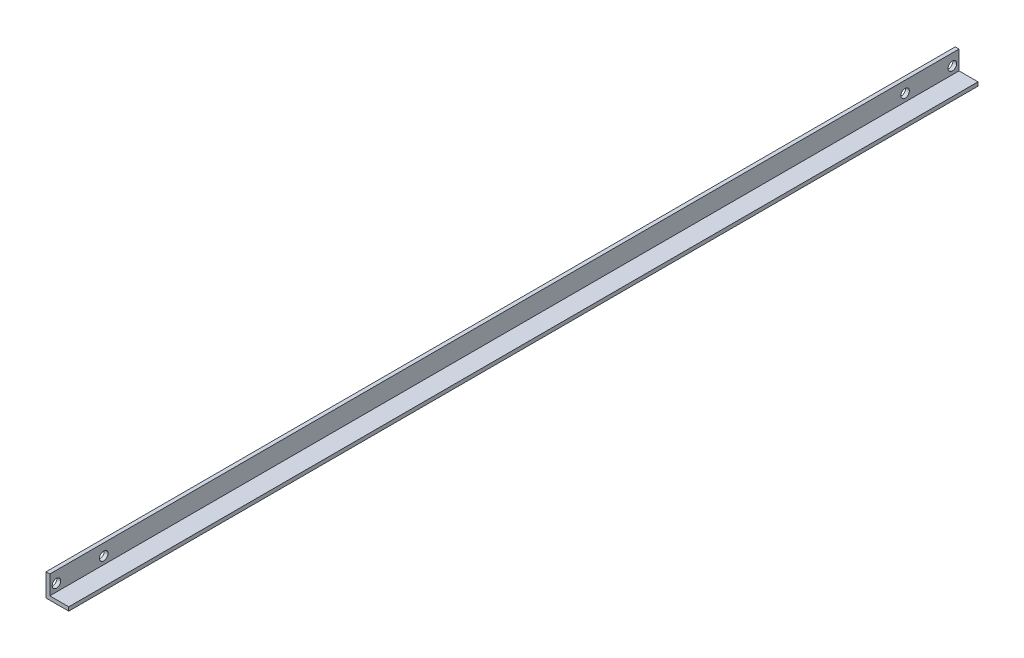
ISO-10303-21;
HEADER;
FILE_DESCRIPTION(('STEP AP214'),'2;1');
FILE_NAME('part.step','',(''),(''),'','','');
FILE_SCHEMA(('AUTOMOTIVE_DESIGN { 1 0 10303 214 1 1 1 1 }'));
ENDSEC;
DATA;
#1=APPLICATION_CONTEXT('core data for automotive mechanical design processes');
#2=APPLICATION_PROTOCOL_DEFINITION('international standard','automotive_design',2000,#1);
#3=PRODUCT_CONTEXT('',#1,'mechanical');
#4=PRODUCT('Part','Part','',(#3));
#5=PRODUCT_RELATED_PRODUCT_CATEGORY('part','',(#4));
#6=PRODUCT_DEFINITION_FORMATION('','',#4);
#7=PRODUCT_DEFINITION_CONTEXT('part definition',#1,'design');
#8=PRODUCT_DEFINITION('design','',#6,#7);
#9=PRODUCT_DEFINITION_SHAPE('','',#8);
#10=(LENGTH_UNIT() NAMED_UNIT(*) SI_UNIT(.MILLI.,.METRE.));
#11=(NAMED_UNIT(*) PLANE_ANGLE_UNIT() SI_UNIT($,.RADIAN.));
#12=(NAMED_UNIT(*) SI_UNIT($,.STERADIAN.) SOLID_ANGLE_UNIT());
#13=UNCERTAINTY_MEASURE_WITH_UNIT(LENGTH_MEASURE(1.E-05),#10,'distance_accuracy_value','');
#14=(GEOMETRIC_REPRESENTATION_CONTEXT(3) GLOBAL_UNCERTAINTY_ASSIGNED_CONTEXT((#13)) GLOBAL_UNIT_ASSIGNED_CONTEXT((#10,
#11,#12)) REPRESENTATION_CONTEXT('',''));
#15=CARTESIAN_POINT('',(0.,0.,0.));
#16=DIRECTION('',(0.,0.,1.));
#17=DIRECTION('',(1.,0.,0.));
#18=AXIS2_PLACEMENT_3D('',#15,#16,#17);
#19=CARTESIAN_POINT('',(0.,19.05,762.));
#20=DIRECTION('',(1.,0.,0.));
#21=DIRECTION('',(0.,1.,0.));
#22=AXIS2_PLACEMENT_3D('',#19,#20,#21);
#23=PLANE('',#22);
#24=CARTESIAN_POINT('',(0.,9.525,5.58800000000004));
#25=DIRECTION('',(-1.,0.,0.));
#26=DIRECTION('',(0.,0.,1.));
#27=AXIS2_PLACEMENT_3D('',#24,#25,#26);
#28=CIRCLE('',#27,3.571875);
#29=CARTESIAN_POINT('',(0.,9.525,9.15987500000004));
#30=VERTEX_POINT('',#29);
#31=EDGE_CURVE('E185',#30,#30,#28,.T.);
#32=ORIENTED_EDGE('',*,*,#31,.F.);
#33=EDGE_LOOP('',(#32));
#34=FACE_BOUND('',#33,.T.);
#35=CARTESIAN_POINT('',(0.,9.525,45.212));
#36=DIRECTION('',(-1.,0.,0.));
#37=DIRECTION('',(0.,0.,1.));
#38=AXIS2_PLACEMENT_3D('',#35,#36,#37);
#39=CIRCLE('',#38,3.571875);
#40=CARTESIAN_POINT('',(0.,9.525,48.783875));
#41=VERTEX_POINT('',#40);
#42=EDGE_CURVE('E149',#41,#41,#39,.T.);
#43=ORIENTED_EDGE('',*,*,#42,.F.);
#44=EDGE_LOOP('',(#43));
#45=FACE_BOUND('',#44,.T.);
#46=CARTESIAN_POINT('',(0.,9.525,716.787));
#47=DIRECTION('',(-1.,0.,0.));
#48=DIRECTION('',(0.,0.,1.));
#49=AXIS2_PLACEMENT_3D('',#46,#47,#48);
#50=CIRCLE('',#49,3.571875);
#51=CARTESIAN_POINT('',(0.,9.525,720.358875));
#52=VERTEX_POINT('',#51);
#53=EDGE_CURVE('E138',#52,#52,#50,.T.);
#54=ORIENTED_EDGE('',*,*,#53,.F.);
#55=EDGE_LOOP('',(#54));
#56=FACE_BOUND('',#55,.T.);
#57=CARTESIAN_POINT('',(0.,9.525,756.412));
#58=DIRECTION('',(-1.,0.,0.));
#59=DIRECTION('',(0.,0.,1.));
#60=AXIS2_PLACEMENT_3D('',#57,#58,#59);
#61=CIRCLE('',#60,3.571875);
#62=CARTESIAN_POINT('',(0.,9.525,759.983875));
#63=VERTEX_POINT('',#62);
#64=EDGE_CURVE('E137',#63,#63,#61,.T.);
#65=ORIENTED_EDGE('',*,*,#64,.F.);
#66=EDGE_LOOP('',(#65));
#67=FACE_BOUND('',#66,.T.);
#68=DIRECTION('',(0.,-1.,0.));
#69=VECTOR('',#68,1.);
#70=CARTESIAN_POINT('',(0.,19.05,0.));
#71=LINE('',#70,#69);
#72=CARTESIAN_POINT('',(0.,19.05,0.));
#73=VERTEX_POINT('',#72);
#74=CARTESIAN_POINT('',(0.,0.,0.));
#75=VERTEX_POINT('',#74);
#76=EDGE_CURVE('E119',#73,#75,#71,.T.);
#77=ORIENTED_EDGE('',*,*,#76,.T.);
#78=DIRECTION('',(0.,0.,-1.));
#79=VECTOR('',#78,1.);
#80=CARTESIAN_POINT('',(0.,0.,762.));
#81=LINE('',#80,#79);
#82=CARTESIAN_POINT('',(0.,0.,762.));
#83=VERTEX_POINT('',#82);
#84=EDGE_CURVE('E11',#83,#75,#81,.T.);
#85=ORIENTED_EDGE('',*,*,#84,.F.);
#86=DIRECTION('',(0.,-1.,0.));
#87=VECTOR('',#86,1.);
#88=CARTESIAN_POINT('',(0.,19.05,762.));
#89=LINE('',#88,#87);
#90=CARTESIAN_POINT('',(0.,19.05,762.));
#91=VERTEX_POINT('',#90);
#92=EDGE_CURVE('E130',#91,#83,#89,.T.);
#93=ORIENTED_EDGE('',*,*,#92,.F.);
#94=DIRECTION('',(0.,0.,-1.));
#95=VECTOR('',#94,1.);
#96=CARTESIAN_POINT('',(0.,19.05,762.));
#97=LINE('',#96,#95);
#98=EDGE_CURVE('E115',#91,#73,#97,.T.);
#99=ORIENTED_EDGE('',*,*,#98,.T.);
#100=EDGE_LOOP('',(#77,#85,#93,#99));
#101=FACE_BOUND('',#100,.T.);
#102=ADVANCED_FACE('F33',(#34,#45,#56,#67,#101),#23,.F.);
#103=CARTESIAN_POINT('',(0.,0.,762.));
#104=DIRECTION('',(0.,1.,0.));
#105=DIRECTION('',(0.,0.,1.));
#106=AXIS2_PLACEMENT_3D('',#103,#104,#105);
#107=PLANE('',#106);
#108=DIRECTION('',(1.,0.,0.));
#109=VECTOR('',#108,1.);
#110=CARTESIAN_POINT('',(0.,0.,0.));
#111=LINE('',#110,#109);
#112=CARTESIAN_POINT('',(19.05,0.,0.));
#113=VERTEX_POINT('',#112);
#114=EDGE_CURVE('E122',#75,#113,#111,.T.);
#115=ORIENTED_EDGE('',*,*,#114,.T.);
#116=DIRECTION('',(0.,0.,-1.));
#117=VECTOR('',#116,1.);
#118=CARTESIAN_POINT('',(19.05,0.,762.));
#119=LINE('',#118,#117);
#120=CARTESIAN_POINT('',(19.05,0.,762.));
#121=VERTEX_POINT('',#120);
#122=EDGE_CURVE('E42',#121,#113,#119,.T.);
#123=ORIENTED_EDGE('',*,*,#122,.F.);
#124=DIRECTION('',(1.,0.,0.));
#125=VECTOR('',#124,1.);
#126=CARTESIAN_POINT('',(0.,0.,762.));
#127=LINE('',#126,#125);
#128=EDGE_CURVE('E88',#83,#121,#127,.T.);
#129=ORIENTED_EDGE('',*,*,#128,.F.);
#130=ORIENTED_EDGE('',*,*,#84,.T.);
#131=EDGE_LOOP('',(#115,#123,#129,#130));
#132=FACE_BOUND('',#131,.T.);
#133=ADVANCED_FACE('F158',(#132),#107,.F.);
#134=CARTESIAN_POINT('',(19.05,0.,762.));
#135=DIRECTION('',(-1.,0.,0.));
#136=DIRECTION('',(0.,0.,1.));
#137=AXIS2_PLACEMENT_3D('',#134,#135,#136);
#138=PLANE('',#137);
#139=DIRECTION('',(0.,1.,0.));
#140=VECTOR('',#139,1.);
#141=CARTESIAN_POINT('',(19.05,0.,0.));
#142=LINE('',#141,#140);
#143=CARTESIAN_POINT('',(19.05,3.175,0.));
#144=VERTEX_POINT('',#143);
#145=EDGE_CURVE('E125',#113,#144,#142,.T.);
#146=ORIENTED_EDGE('',*,*,#145,.T.);
#147=DIRECTION('',(0.,0.,-1.));
#148=VECTOR('',#147,1.);
#149=CARTESIAN_POINT('',(19.05,3.175,762.));
#150=LINE('',#149,#148);
#151=CARTESIAN_POINT('',(19.05,3.175,762.));
#152=VERTEX_POINT('',#151);
#153=EDGE_CURVE('E110',#152,#144,#150,.T.);
#154=ORIENTED_EDGE('',*,*,#153,.F.);
#155=DIRECTION('',(0.,1.,0.));
#156=VECTOR('',#155,1.);
#157=CARTESIAN_POINT('',(19.05,0.,762.));
#158=LINE('',#157,#156);
#159=EDGE_CURVE('E101',#121,#152,#158,.T.);
#160=ORIENTED_EDGE('',*,*,#159,.F.);
#161=ORIENTED_EDGE('',*,*,#122,.T.);
#162=EDGE_LOOP('',(#146,#154,#160,#161));
#163=FACE_BOUND('',#162,.T.);
#164=ADVANCED_FACE('F161',(#163),#138,.F.);
#165=CARTESIAN_POINT('',(19.05,3.175,762.));
#166=DIRECTION('',(0.,-1.,0.));
#167=DIRECTION('',(1.,0.,0.));
#168=AXIS2_PLACEMENT_3D('',#165,#166,#167);
#169=PLANE('',#168);
#170=DIRECTION('',(-1.,0.,0.));
#171=VECTOR('',#170,1.);
#172=CARTESIAN_POINT('',(19.05,3.175,0.));
#173=LINE('',#172,#171);
#174=CARTESIAN_POINT('',(3.175,3.175,0.));
#175=VERTEX_POINT('',#174);
#176=EDGE_CURVE('E109',#144,#175,#173,.T.);
#177=ORIENTED_EDGE('',*,*,#176,.T.);
#178=DIRECTION('',(0.,0.,-1.));
#179=VECTOR('',#178,1.);
#180=CARTESIAN_POINT('',(3.175,3.175,762.));
#181=LINE('',#180,#179);
#182=CARTESIAN_POINT('',(3.175,3.175,762.));
#183=VERTEX_POINT('',#182);
#184=EDGE_CURVE('E106',#183,#175,#181,.T.);
#185=ORIENTED_EDGE('',*,*,#184,.F.);
#186=DIRECTION('',(-1.,0.,0.));
#187=VECTOR('',#186,1.);
#188=CARTESIAN_POINT('',(19.05,3.175,762.));
#189=LINE('',#188,#187);
#190=EDGE_CURVE('E95',#152,#183,#189,.T.);
#191=ORIENTED_EDGE('',*,*,#190,.F.);
#192=ORIENTED_EDGE('',*,*,#153,.T.);
#193=EDGE_LOOP('',(#177,#185,#191,#192));
#194=FACE_BOUND('',#193,.T.);
#195=ADVANCED_FACE('F107',(#194),#169,.F.);
#196=CARTESIAN_POINT('',(3.175,3.175,762.));
#197=DIRECTION('',(-1.,0.,0.));
#198=DIRECTION('',(0.,-1.,0.));
#199=AXIS2_PLACEMENT_3D('',#196,#197,#198);
#200=PLANE('',#199);
#201=CARTESIAN_POINT('',(3.175,9.525,5.58800000000004));
#202=DIRECTION('',(-1.,0.,0.));
#203=DIRECTION('',(0.,-1.,0.));
#204=AXIS2_PLACEMENT_3D('',#201,#202,#203);
#205=CIRCLE('',#204,3.571875);
#206=CARTESIAN_POINT('',(3.175,5.953125,5.58800000000004));
#207=VERTEX_POINT('',#206);
#208=EDGE_CURVE('E36',#207,#207,#205,.T.);
#209=ORIENTED_EDGE('',*,*,#208,.T.);
#210=EDGE_LOOP('',(#209));
#211=FACE_BOUND('',#210,.T.);
#212=CARTESIAN_POINT('',(3.175,9.525,45.212));
#213=DIRECTION('',(-1.,0.,0.));
#214=DIRECTION('',(0.,-1.,0.));
#215=AXIS2_PLACEMENT_3D('',#212,#213,#214);
#216=CIRCLE('',#215,3.571875);
#217=CARTESIAN_POINT('',(3.175,5.953125,45.212));
#218=VERTEX_POINT('',#217);
#219=EDGE_CURVE('E144',#218,#218,#216,.T.);
#220=ORIENTED_EDGE('',*,*,#219,.T.);
#221=EDGE_LOOP('',(#220));
#222=FACE_BOUND('',#221,.T.);
#223=CARTESIAN_POINT('',(3.175,9.525,716.787));
#224=DIRECTION('',(-1.,0.,0.));
#225=DIRECTION('',(0.,-1.,0.));
#226=AXIS2_PLACEMENT_3D('',#223,#224,#225);
#227=CIRCLE('',#226,3.571875);
#228=CARTESIAN_POINT('',(3.175,5.953125,716.787));
#229=VERTEX_POINT('',#228);
#230=EDGE_CURVE('E135',#229,#229,#227,.T.);
#231=ORIENTED_EDGE('',*,*,#230,.T.);
#232=EDGE_LOOP('',(#231));
#233=FACE_BOUND('',#232,.T.);
#234=CARTESIAN_POINT('',(3.175,9.525,756.412));
#235=DIRECTION('',(-1.,0.,0.));
#236=DIRECTION('',(0.,-1.,0.));
#237=AXIS2_PLACEMENT_3D('',#234,#235,#236);
#238=CIRCLE('',#237,3.571875);
#239=CARTESIAN_POINT('',(3.175,5.953125,756.412));
#240=VERTEX_POINT('',#239);
#241=EDGE_CURVE('E123',#240,#240,#238,.T.);
#242=ORIENTED_EDGE('',*,*,#241,.T.);
#243=EDGE_LOOP('',(#242));
#244=FACE_BOUND('',#243,.T.);
#245=DIRECTION('',(0.,1.,0.));
#246=VECTOR('',#245,1.);
#247=CARTESIAN_POINT('',(3.175,3.175,0.));
#248=LINE('',#247,#246);
#249=CARTESIAN_POINT('',(3.175,19.05,0.));
#250=VERTEX_POINT('',#249);
#251=EDGE_CURVE('E74',#175,#250,#248,.T.);
#252=ORIENTED_EDGE('',*,*,#251,.T.);
#253=DIRECTION('',(0.,0.,-1.));
#254=VECTOR('',#253,1.);
#255=CARTESIAN_POINT('',(3.175,19.05,762.));
#256=LINE('',#255,#254);
#257=CARTESIAN_POINT('',(3.175,19.05,762.));
#258=VERTEX_POINT('',#257);
#259=EDGE_CURVE('E111',#258,#250,#256,.T.);
#260=ORIENTED_EDGE('',*,*,#259,.F.);
#261=DIRECTION('',(0.,1.,0.));
#262=VECTOR('',#261,1.);
#263=CARTESIAN_POINT('',(3.175,3.175,762.));
#264=LINE('',#263,#262);
#265=EDGE_CURVE('E99',#183,#258,#264,.T.);
#266=ORIENTED_EDGE('',*,*,#265,.F.);
#267=ORIENTED_EDGE('',*,*,#184,.T.);
#268=EDGE_LOOP('',(#252,#260,#266,#267));
#269=FACE_BOUND('',#268,.T.);
#270=ADVANCED_FACE('F113',(#211,#222,#233,#244,#269),#200,.F.);
#271=CARTESIAN_POINT('',(3.175,19.05,762.));
#272=DIRECTION('',(0.,-1.,0.));
#273=DIRECTION('',(0.,0.,-1.));
#274=AXIS2_PLACEMENT_3D('',#271,#272,#273);
#275=PLANE('',#274);
#276=DIRECTION('',(-1.,0.,0.));
#277=VECTOR('',#276,1.);
#278=CARTESIAN_POINT('',(3.175,19.05,0.));
#279=LINE('',#278,#277);
#280=EDGE_CURVE('E80',#250,#73,#279,.T.);
#281=ORIENTED_EDGE('',*,*,#280,.T.);
#282=ORIENTED_EDGE('',*,*,#98,.F.);
#283=DIRECTION('',(-1.,0.,0.));
#284=VECTOR('',#283,1.);
#285=CARTESIAN_POINT('',(3.175,19.05,762.));
#286=LINE('',#285,#284);
#287=EDGE_CURVE('E51',#258,#91,#286,.T.);
#288=ORIENTED_EDGE('',*,*,#287,.F.);
#289=ORIENTED_EDGE('',*,*,#259,.T.);
#290=EDGE_LOOP('',(#281,#282,#288,#289));
#291=FACE_BOUND('',#290,.T.);
#292=ADVANCED_FACE('F166',(#291),#275,.F.);
#293=CARTESIAN_POINT('',(0.,0.,762.));
#294=DIRECTION('',(0.,0.,1.));
#295=DIRECTION('',(1.,0.,0.));
#296=AXIS2_PLACEMENT_3D('',#293,#294,#295);
#297=PLANE('',#296);
#298=ORIENTED_EDGE('',*,*,#92,.T.);
#299=ORIENTED_EDGE('',*,*,#128,.T.);
#300=ORIENTED_EDGE('',*,*,#159,.T.);
#301=ORIENTED_EDGE('',*,*,#190,.T.);
#302=ORIENTED_EDGE('',*,*,#265,.T.);
#303=ORIENTED_EDGE('',*,*,#287,.T.);
#304=EDGE_LOOP('',(#298,#299,#300,#301,#302,#303));
#305=FACE_BOUND('',#304,.T.);
#306=ADVANCED_FACE('F97',(#305),#297,.T.);
#307=CARTESIAN_POINT('',(0.,0.,0.));
#308=DIRECTION('',(0.,0.,1.));
#309=DIRECTION('',(1.,0.,0.));
#310=AXIS2_PLACEMENT_3D('',#307,#308,#309);
#311=PLANE('',#310);
#312=ORIENTED_EDGE('',*,*,#76,.F.);
#313=ORIENTED_EDGE('',*,*,#280,.F.);
#314=ORIENTED_EDGE('',*,*,#251,.F.);
#315=ORIENTED_EDGE('',*,*,#176,.F.);
#316=ORIENTED_EDGE('',*,*,#145,.F.);
#317=ORIENTED_EDGE('',*,*,#114,.F.);
#318=EDGE_LOOP('',(#312,#313,#314,#315,#316,#317));
#319=FACE_BOUND('',#318,.T.);
#320=ADVANCED_FACE('F164',(#319),#311,.F.);
#321=CARTESIAN_POINT('',(0.,9.525,756.412));
#322=DIRECTION('',(-1.,0.,0.));
#323=DIRECTION('',(0.,0.,1.));
#324=AXIS2_PLACEMENT_3D('',#321,#322,#323);
#325=CYLINDRICAL_SURFACE('',#324,3.571875);
#326=ORIENTED_EDGE('',*,*,#64,.T.);
#327=EDGE_LOOP('',(#326));
#328=FACE_BOUND('',#327,.T.);
#329=ORIENTED_EDGE('',*,*,#241,.F.);
#330=EDGE_LOOP('',(#329));
#331=FACE_BOUND('',#330,.T.);
#332=ADVANCED_FACE('F192',(#328,#331),#325,.F.);
#333=CARTESIAN_POINT('',(0.,9.525,716.787));
#334=DIRECTION('',(-1.,0.,0.));
#335=DIRECTION('',(0.,0.,1.));
#336=AXIS2_PLACEMENT_3D('',#333,#334,#335);
#337=CYLINDRICAL_SURFACE('',#336,3.571875);
#338=ORIENTED_EDGE('',*,*,#53,.T.);
#339=EDGE_LOOP('',(#338));
#340=FACE_BOUND('',#339,.T.);
#341=ORIENTED_EDGE('',*,*,#230,.F.);
#342=EDGE_LOOP('',(#341));
#343=FACE_BOUND('',#342,.T.);
#344=ADVANCED_FACE('F195',(#340,#343),#337,.F.);
#345=CARTESIAN_POINT('',(0.,9.525,45.212));
#346=DIRECTION('',(-1.,0.,0.));
#347=DIRECTION('',(0.,0.,1.));
#348=AXIS2_PLACEMENT_3D('',#345,#346,#347);
#349=CYLINDRICAL_SURFACE('',#348,3.571875);
#350=ORIENTED_EDGE('',*,*,#42,.T.);
#351=EDGE_LOOP('',(#350));
#352=FACE_BOUND('',#351,.T.);
#353=ORIENTED_EDGE('',*,*,#219,.F.);
#354=EDGE_LOOP('',(#353));
#355=FACE_BOUND('',#354,.T.);
#356=ADVANCED_FACE('F203',(#352,#355),#349,.F.);
#357=CARTESIAN_POINT('',(0.,9.525,5.58800000000004));
#358=DIRECTION('',(-1.,0.,0.));
#359=DIRECTION('',(0.,0.,1.));
#360=AXIS2_PLACEMENT_3D('',#357,#358,#359);
#361=CYLINDRICAL_SURFACE('',#360,3.571875);
#362=ORIENTED_EDGE('',*,*,#31,.T.);
#363=EDGE_LOOP('',(#362));
#364=FACE_BOUND('',#363,.T.);
#365=ORIENTED_EDGE('',*,*,#208,.F.);
#366=EDGE_LOOP('',(#365));
#367=FACE_BOUND('',#366,.T.);
#368=ADVANCED_FACE('F208',(#364,#367),#361,.F.);
#369=CLOSED_SHELL('',(#102,#133,#164,#195,#270,#292,#306,#320,#332,#344,#356,#368));
#370=MANIFOLD_SOLID_BREP('B2',#369);
#371=ADVANCED_BREP_SHAPE_REPRESENTATION('',(#18,#370),#14);
#372=SHAPE_DEFINITION_REPRESENTATION(#9,#371);
ENDSEC;
END-ISO-10303-21;
